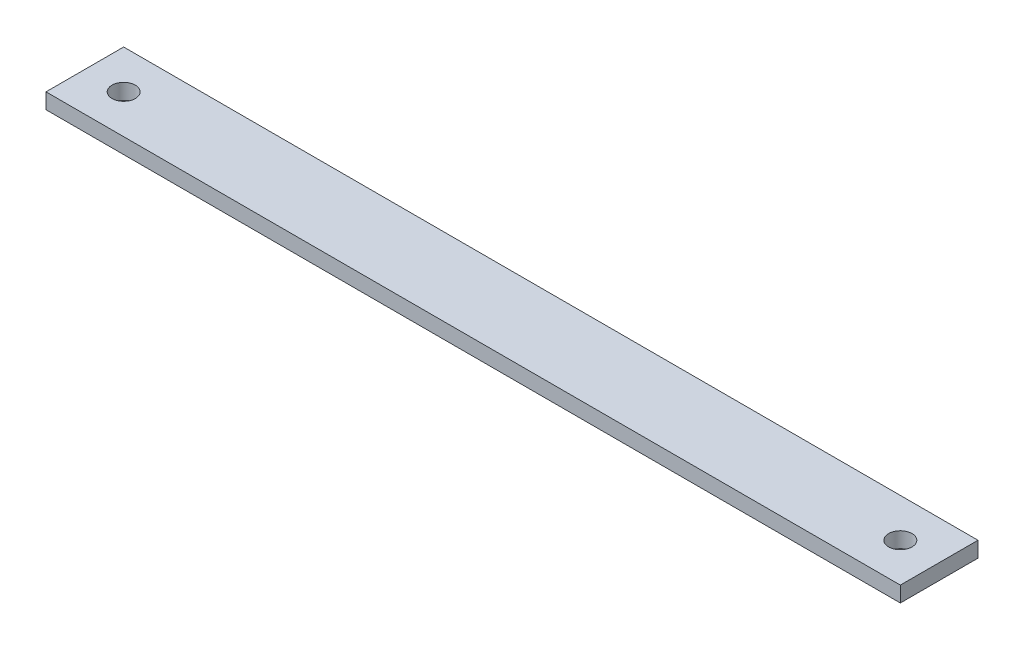
ISO-10303-21;
HEADER;
FILE_DESCRIPTION(('STEP AP214'),'2;1');
FILE_NAME('part.step','',(''),(''),'','','');
FILE_SCHEMA(('AUTOMOTIVE_DESIGN { 1 0 10303 214 1 1 1 1 }'));
ENDSEC;
DATA;
#1=APPLICATION_CONTEXT('core data for automotive mechanical design processes');
#2=APPLICATION_PROTOCOL_DEFINITION('international standard','automotive_design',2000,#1);
#3=PRODUCT_CONTEXT('',#1,'mechanical');
#4=PRODUCT('Part','Part','',(#3));
#5=PRODUCT_RELATED_PRODUCT_CATEGORY('part','',(#4));
#6=PRODUCT_DEFINITION_FORMATION('','',#4);
#7=PRODUCT_DEFINITION_CONTEXT('part definition',#1,'design');
#8=PRODUCT_DEFINITION('design','',#6,#7);
#9=PRODUCT_DEFINITION_SHAPE('','',#8);
#10=(LENGTH_UNIT() NAMED_UNIT(*) SI_UNIT(.MILLI.,.METRE.));
#11=(NAMED_UNIT(*) PLANE_ANGLE_UNIT() SI_UNIT($,.RADIAN.));
#12=(NAMED_UNIT(*) SI_UNIT($,.STERADIAN.) SOLID_ANGLE_UNIT());
#13=UNCERTAINTY_MEASURE_WITH_UNIT(LENGTH_MEASURE(1.E-05),#10,'distance_accuracy_value','');
#14=(GEOMETRIC_REPRESENTATION_CONTEXT(3) GLOBAL_UNCERTAINTY_ASSIGNED_CONTEXT((#13)) GLOBAL_UNIT_ASSIGNED_CONTEXT((#10,
#11,#12)) REPRESENTATION_CONTEXT('',''));
#15=CARTESIAN_POINT('',(0.,0.,0.));
#16=DIRECTION('',(0.,0.,1.));
#17=DIRECTION('',(1.,0.,0.));
#18=AXIS2_PLACEMENT_3D('',#15,#16,#17);
#19=CARTESIAN_POINT('',(0.,2.,0.));
#20=DIRECTION('',(0.,-1.,0.));
#21=DIRECTION('',(0.,0.,-1.));
#22=AXIS2_PLACEMENT_3D('',#19,#20,#21);
#23=PLANE('',#22);
#24=DIRECTION('',(0.,0.,-1.));
#25=VECTOR('',#24,1.);
#26=CARTESIAN_POINT('',(55.,2.,5.));
#27=LINE('',#26,#25);
#28=CARTESIAN_POINT('',(55.,2.,5.));
#29=VERTEX_POINT('',#28);
#30=CARTESIAN_POINT('',(55.,2.,-5.));
#31=VERTEX_POINT('',#30);
#32=EDGE_CURVE('E98',#29,#31,#27,.T.);
#33=ORIENTED_EDGE('',*,*,#32,.T.);
#34=DIRECTION('',(-1.,0.,0.));
#35=VECTOR('',#34,1.);
#36=CARTESIAN_POINT('',(-55.,2.,-5.));
#37=LINE('',#36,#35);
#38=CARTESIAN_POINT('',(-55.,2.,-5.));
#39=VERTEX_POINT('',#38);
#40=EDGE_CURVE('E93',#31,#39,#37,.T.);
#41=ORIENTED_EDGE('',*,*,#40,.T.);
#42=DIRECTION('',(0.,0.,1.));
#43=VECTOR('',#42,1.);
#44=CARTESIAN_POINT('',(-55.,2.,5.));
#45=LINE('',#44,#43);
#46=CARTESIAN_POINT('',(-55.,2.,5.));
#47=VERTEX_POINT('',#46);
#48=EDGE_CURVE('E96',#39,#47,#45,.T.);
#49=ORIENTED_EDGE('',*,*,#48,.T.);
#50=DIRECTION('',(1.,0.,0.));
#51=VECTOR('',#50,1.);
#52=CARTESIAN_POINT('',(-55.,2.,5.));
#53=LINE('',#52,#51);
#54=EDGE_CURVE('E63',#47,#29,#53,.T.);
#55=ORIENTED_EDGE('',*,*,#54,.T.);
#56=EDGE_LOOP('',(#33,#41,#49,#55));
#57=FACE_BOUND('',#56,.T.);
#58=CARTESIAN_POINT('',(-50.,2.,0.));
#59=DIRECTION('',(0.,1.,0.));
#60=DIRECTION('',(0.,0.,1.));
#61=AXIS2_PLACEMENT_3D('',#58,#59,#60);
#62=CIRCLE('',#61,1.5);
#63=CARTESIAN_POINT('',(-50.,2.,1.5));
#64=VERTEX_POINT('',#63);
#65=EDGE_CURVE('E118',#64,#64,#62,.T.);
#66=ORIENTED_EDGE('',*,*,#65,.F.);
#67=EDGE_LOOP('',(#66));
#68=FACE_BOUND('',#67,.T.);
#69=CARTESIAN_POINT('',(50.,2.,0.));
#70=DIRECTION('',(0.,1.,0.));
#71=DIRECTION('',(0.,0.,-1.));
#72=AXIS2_PLACEMENT_3D('',#69,#70,#71);
#73=CIRCLE('',#72,1.5);
#74=CARTESIAN_POINT('',(50.,2.,-1.5));
#75=VERTEX_POINT('',#74);
#76=EDGE_CURVE('E140',#75,#75,#73,.T.);
#77=ORIENTED_EDGE('',*,*,#76,.F.);
#78=EDGE_LOOP('',(#77));
#79=FACE_BOUND('',#78,.T.);
#80=ADVANCED_FACE('F45',(#57,#68,#79),#23,.F.);
#81=CARTESIAN_POINT('',(0.,0.,0.));
#82=DIRECTION('',(0.,-1.,0.));
#83=DIRECTION('',(0.,0.,-1.));
#84=AXIS2_PLACEMENT_3D('',#81,#82,#83);
#85=PLANE('',#84);
#86=CARTESIAN_POINT('',(-50.,0.,0.));
#87=DIRECTION('',(0.,1.,0.));
#88=DIRECTION('',(0.,0.,1.));
#89=AXIS2_PLACEMENT_3D('',#86,#87,#88);
#90=CIRCLE('',#89,1.5);
#91=CARTESIAN_POINT('',(-50.,0.,1.5));
#92=VERTEX_POINT('',#91);
#93=EDGE_CURVE('E136',#92,#92,#90,.T.);
#94=ORIENTED_EDGE('',*,*,#93,.T.);
#95=EDGE_LOOP('',(#94));
#96=FACE_BOUND('',#95,.T.);
#97=DIRECTION('',(0.,0.,-1.));
#98=VECTOR('',#97,1.);
#99=CARTESIAN_POINT('',(55.,0.,5.));
#100=LINE('',#99,#98);
#101=CARTESIAN_POINT('',(55.,0.,5.));
#102=VERTEX_POINT('',#101);
#103=CARTESIAN_POINT('',(55.,0.,-5.));
#104=VERTEX_POINT('',#103);
#105=EDGE_CURVE('E114',#102,#104,#100,.T.);
#106=ORIENTED_EDGE('',*,*,#105,.F.);
#107=DIRECTION('',(1.,0.,0.));
#108=VECTOR('',#107,1.);
#109=CARTESIAN_POINT('',(-55.,0.,5.));
#110=LINE('',#109,#108);
#111=CARTESIAN_POINT('',(-55.,0.,5.));
#112=VERTEX_POINT('',#111);
#113=EDGE_CURVE('E86',#112,#102,#110,.T.);
#114=ORIENTED_EDGE('',*,*,#113,.F.);
#115=DIRECTION('',(0.,0.,1.));
#116=VECTOR('',#115,1.);
#117=CARTESIAN_POINT('',(-55.,0.,5.));
#118=LINE('',#117,#116);
#119=CARTESIAN_POINT('',(-55.,0.,-5.));
#120=VERTEX_POINT('',#119);
#121=EDGE_CURVE('E80',#120,#112,#118,.T.);
#122=ORIENTED_EDGE('',*,*,#121,.F.);
#123=DIRECTION('',(-1.,0.,0.));
#124=VECTOR('',#123,1.);
#125=CARTESIAN_POINT('',(-55.,0.,-5.));
#126=LINE('',#125,#124);
#127=EDGE_CURVE('E103',#104,#120,#126,.T.);
#128=ORIENTED_EDGE('',*,*,#127,.F.);
#129=EDGE_LOOP('',(#106,#114,#122,#128));
#130=FACE_BOUND('',#129,.T.);
#131=CARTESIAN_POINT('',(50.,0.,0.));
#132=DIRECTION('',(0.,1.,0.));
#133=DIRECTION('',(0.,0.,-1.));
#134=AXIS2_PLACEMENT_3D('',#131,#132,#133);
#135=CIRCLE('',#134,1.5);
#136=CARTESIAN_POINT('',(50.,0.,-1.5));
#137=VERTEX_POINT('',#136);
#138=EDGE_CURVE('E144',#137,#137,#135,.T.);
#139=ORIENTED_EDGE('',*,*,#138,.T.);
#140=EDGE_LOOP('',(#139));
#141=FACE_BOUND('',#140,.T.);
#142=ADVANCED_FACE('F131',(#96,#130,#141),#85,.T.);
#143=CARTESIAN_POINT('',(55.,2.,5.));
#144=DIRECTION('',(-1.,0.,0.));
#145=DIRECTION('',(0.,0.,1.));
#146=AXIS2_PLACEMENT_3D('',#143,#144,#145);
#147=PLANE('',#146);
#148=ORIENTED_EDGE('',*,*,#105,.T.);
#149=DIRECTION('',(0.,-1.,0.));
#150=VECTOR('',#149,1.);
#151=CARTESIAN_POINT('',(55.,2.,-5.));
#152=LINE('',#151,#150);
#153=EDGE_CURVE('E11',#31,#104,#152,.T.);
#154=ORIENTED_EDGE('',*,*,#153,.F.);
#155=ORIENTED_EDGE('',*,*,#32,.F.);
#156=DIRECTION('',(0.,-1.,0.));
#157=VECTOR('',#156,1.);
#158=CARTESIAN_POINT('',(55.,2.,5.));
#159=LINE('',#158,#157);
#160=EDGE_CURVE('E110',#29,#102,#159,.T.);
#161=ORIENTED_EDGE('',*,*,#160,.T.);
#162=EDGE_LOOP('',(#148,#154,#155,#161));
#163=FACE_BOUND('',#162,.T.);
#164=ADVANCED_FACE('F47',(#163),#147,.F.);
#165=CARTESIAN_POINT('',(-55.,2.,-5.));
#166=DIRECTION('',(0.,0.,1.));
#167=DIRECTION('',(1.,0.,0.));
#168=AXIS2_PLACEMENT_3D('',#165,#166,#167);
#169=PLANE('',#168);
#170=ORIENTED_EDGE('',*,*,#127,.T.);
#171=DIRECTION('',(0.,-1.,0.));
#172=VECTOR('',#171,1.);
#173=CARTESIAN_POINT('',(-55.,2.,-5.));
#174=LINE('',#173,#172);
#175=EDGE_CURVE('E55',#39,#120,#174,.T.);
#176=ORIENTED_EDGE('',*,*,#175,.F.);
#177=ORIENTED_EDGE('',*,*,#40,.F.);
#178=ORIENTED_EDGE('',*,*,#153,.T.);
#179=EDGE_LOOP('',(#170,#176,#177,#178));
#180=FACE_BOUND('',#179,.T.);
#181=ADVANCED_FACE('F102',(#180),#169,.F.);
#182=CARTESIAN_POINT('',(-55.,2.,5.));
#183=DIRECTION('',(1.,0.,0.));
#184=DIRECTION('',(0.,0.,-1.));
#185=AXIS2_PLACEMENT_3D('',#182,#183,#184);
#186=PLANE('',#185);
#187=ORIENTED_EDGE('',*,*,#121,.T.);
#188=DIRECTION('',(0.,-1.,0.));
#189=VECTOR('',#188,1.);
#190=CARTESIAN_POINT('',(-55.,2.,5.));
#191=LINE('',#190,#189);
#192=EDGE_CURVE('E105',#47,#112,#191,.T.);
#193=ORIENTED_EDGE('',*,*,#192,.F.);
#194=ORIENTED_EDGE('',*,*,#48,.F.);
#195=ORIENTED_EDGE('',*,*,#175,.T.);
#196=EDGE_LOOP('',(#187,#193,#194,#195));
#197=FACE_BOUND('',#196,.T.);
#198=ADVANCED_FACE('F106',(#197),#186,.F.);
#199=CARTESIAN_POINT('',(-55.,2.,5.));
#200=DIRECTION('',(0.,0.,-1.));
#201=DIRECTION('',(-1.,0.,0.));
#202=AXIS2_PLACEMENT_3D('',#199,#200,#201);
#203=PLANE('',#202);
#204=ORIENTED_EDGE('',*,*,#113,.T.);
#205=ORIENTED_EDGE('',*,*,#160,.F.);
#206=ORIENTED_EDGE('',*,*,#54,.F.);
#207=ORIENTED_EDGE('',*,*,#192,.T.);
#208=EDGE_LOOP('',(#204,#205,#206,#207));
#209=FACE_BOUND('',#208,.T.);
#210=ADVANCED_FACE('F128',(#209),#203,.F.);
#211=CARTESIAN_POINT('',(-50.,2.,0.));
#212=DIRECTION('',(0.,-1.,0.));
#213=DIRECTION('',(0.,0.,-1.));
#214=AXIS2_PLACEMENT_3D('',#211,#212,#213);
#215=CYLINDRICAL_SURFACE('',#214,1.5);
#216=ORIENTED_EDGE('',*,*,#65,.T.);
#217=EDGE_LOOP('',(#216));
#218=FACE_BOUND('',#217,.T.);
#219=ORIENTED_EDGE('',*,*,#93,.F.);
#220=EDGE_LOOP('',(#219));
#221=FACE_BOUND('',#220,.T.);
#222=ADVANCED_FACE('F163',(#218,#221),#215,.F.);
#223=CARTESIAN_POINT('',(50.,2.,0.));
#224=DIRECTION('',(0.,-1.,0.));
#225=DIRECTION('',(0.,0.,-1.));
#226=AXIS2_PLACEMENT_3D('',#223,#224,#225);
#227=CYLINDRICAL_SURFACE('',#226,1.5);
#228=ORIENTED_EDGE('',*,*,#76,.T.);
#229=EDGE_LOOP('',(#228));
#230=FACE_BOUND('',#229,.T.);
#231=ORIENTED_EDGE('',*,*,#138,.F.);
#232=EDGE_LOOP('',(#231));
#233=FACE_BOUND('',#232,.T.);
#234=ADVANCED_FACE('F152',(#230,#233),#227,.F.);
#235=CLOSED_SHELL('',(#80,#142,#164,#181,#198,#210,#222,#234));
#236=MANIFOLD_SOLID_BREP('B2',#235);
#237=ADVANCED_BREP_SHAPE_REPRESENTATION('',(#18,#236),#14);
#238=SHAPE_DEFINITION_REPRESENTATION(#9,#237);
ENDSEC;
END-ISO-10303-21;
